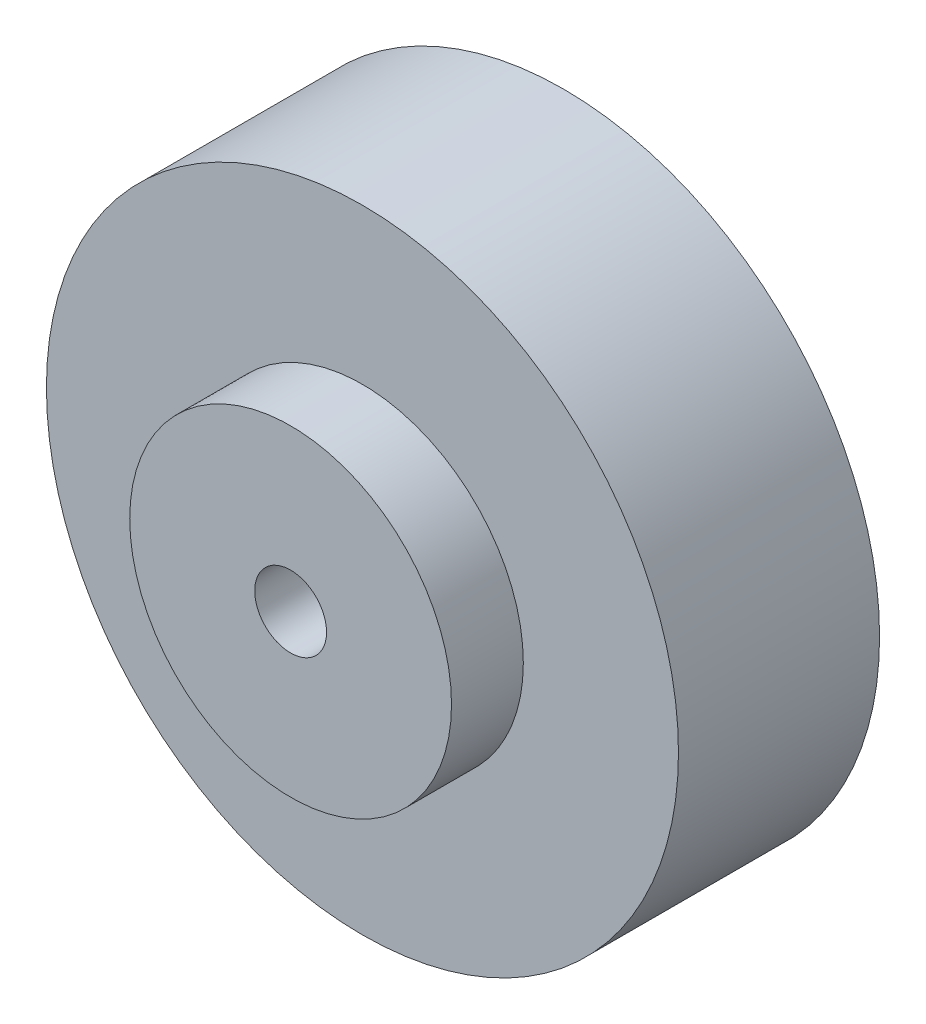
ISO-10303-21;
HEADER;
FILE_DESCRIPTION(('STEP AP214'),'2;1');
FILE_NAME('part.step','',(''),(''),'','','');
FILE_SCHEMA(('AUTOMOTIVE_DESIGN { 1 0 10303 214 1 1 1 1 }'));
ENDSEC;
DATA;
#1=APPLICATION_CONTEXT('core data for automotive mechanical design processes');
#2=APPLICATION_PROTOCOL_DEFINITION('international standard','automotive_design',2000,#1);
#3=PRODUCT_CONTEXT('',#1,'mechanical');
#4=PRODUCT('Part','Part','',(#3));
#5=PRODUCT_RELATED_PRODUCT_CATEGORY('part','',(#4));
#6=PRODUCT_DEFINITION_FORMATION('','',#4);
#7=PRODUCT_DEFINITION_CONTEXT('part definition',#1,'design');
#8=PRODUCT_DEFINITION('design','',#6,#7);
#9=PRODUCT_DEFINITION_SHAPE('','',#8);
#10=(LENGTH_UNIT() NAMED_UNIT(*) SI_UNIT(.MILLI.,.METRE.));
#11=(NAMED_UNIT(*) PLANE_ANGLE_UNIT() SI_UNIT($,.RADIAN.));
#12=(NAMED_UNIT(*) SI_UNIT($,.STERADIAN.) SOLID_ANGLE_UNIT());
#13=UNCERTAINTY_MEASURE_WITH_UNIT(LENGTH_MEASURE(1.E-05),#10,'distance_accuracy_value','');
#14=(GEOMETRIC_REPRESENTATION_CONTEXT(3) GLOBAL_UNCERTAINTY_ASSIGNED_CONTEXT((#13)) GLOBAL_UNIT_ASSIGNED_CONTEXT((#10,
#11,#12)) REPRESENTATION_CONTEXT('',''));
#15=CARTESIAN_POINT('',(0.,0.,0.));
#16=DIRECTION('',(0.,0.,1.));
#17=DIRECTION('',(1.,0.,0.));
#18=AXIS2_PLACEMENT_3D('',#15,#16,#17);
#19=CARTESIAN_POINT('',(0.,0.,22.225));
#20=DIRECTION('',(0.,0.,-1.));
#21=DIRECTION('',(-1.,0.,0.));
#22=AXIS2_PLACEMENT_3D('',#19,#20,#21);
#23=CYLINDRICAL_SURFACE('',#22,34.925);
#24=CARTESIAN_POINT('',(0.,0.,22.225));
#25=DIRECTION('',(0.,0.,1.));
#26=DIRECTION('',(1.,0.,0.));
#27=AXIS2_PLACEMENT_3D('',#24,#25,#26);
#28=CIRCLE('',#27,34.925);
#29=CARTESIAN_POINT('',(34.925,0.,22.225));
#30=VERTEX_POINT('',#29);
#31=EDGE_CURVE('E53',#30,#30,#28,.T.);
#32=ORIENTED_EDGE('',*,*,#31,.F.);
#33=EDGE_LOOP('',(#32));
#34=FACE_BOUND('',#33,.T.);
#35=CARTESIAN_POINT('',(0.,0.,0.));
#36=DIRECTION('',(0.,0.,1.));
#37=DIRECTION('',(1.,0.,0.));
#38=AXIS2_PLACEMENT_3D('',#35,#36,#37);
#39=CIRCLE('',#38,34.925);
#40=CARTESIAN_POINT('',(34.925,0.,0.));
#41=VERTEX_POINT('',#40);
#42=EDGE_CURVE('E48',#41,#41,#39,.T.);
#43=ORIENTED_EDGE('',*,*,#42,.T.);
#44=EDGE_LOOP('',(#43));
#45=FACE_BOUND('',#44,.T.);
#46=ADVANCED_FACE('F45',(#34,#45),#23,.T.);
#47=CARTESIAN_POINT('',(0.,0.,22.225));
#48=DIRECTION('',(0.,0.,1.));
#49=DIRECTION('',(1.,0.,0.));
#50=AXIS2_PLACEMENT_3D('',#47,#48,#49);
#51=PLANE('',#50);
#52=CARTESIAN_POINT('',(0.,0.,22.225));
#53=DIRECTION('',(0.,0.,1.));
#54=DIRECTION('',(1.,0.,0.));
#55=AXIS2_PLACEMENT_3D('',#52,#53,#54);
#56=CIRCLE('',#55,17.78);
#57=CARTESIAN_POINT('',(17.78,0.,22.225));
#58=VERTEX_POINT('',#57);
#59=EDGE_CURVE('E10',#58,#58,#56,.T.);
#60=ORIENTED_EDGE('',*,*,#59,.F.);
#61=EDGE_LOOP('',(#60));
#62=FACE_BOUND('',#61,.T.);
#63=ORIENTED_EDGE('',*,*,#31,.T.);
#64=EDGE_LOOP('',(#63));
#65=FACE_BOUND('',#64,.T.);
#66=ADVANCED_FACE('F89',(#62,#65),#51,.T.);
#67=CARTESIAN_POINT('',(0.,0.,0.));
#68=DIRECTION('',(0.,0.,1.));
#69=DIRECTION('',(1.,0.,0.));
#70=AXIS2_PLACEMENT_3D('',#67,#68,#69);
#71=PLANE('',#70);
#72=CARTESIAN_POINT('',(0.,0.,0.));
#73=DIRECTION('',(0.,0.,1.));
#74=DIRECTION('',(1.,0.,0.));
#75=AXIS2_PLACEMENT_3D('',#72,#73,#74);
#76=CIRCLE('',#75,3.96875);
#77=CARTESIAN_POINT('',(3.96875,0.,0.));
#78=VERTEX_POINT('',#77);
#79=EDGE_CURVE('E64',#78,#78,#76,.F.);
#80=ORIENTED_EDGE('',*,*,#79,.F.);
#81=EDGE_LOOP('',(#80));
#82=FACE_BOUND('',#81,.T.);
#83=ORIENTED_EDGE('',*,*,#42,.F.);
#84=EDGE_LOOP('',(#83));
#85=FACE_BOUND('',#84,.T.);
#86=ADVANCED_FACE('F84',(#82,#85),#71,.F.);
#87=CARTESIAN_POINT('',(0.,0.,30.1625));
#88=DIRECTION('',(0.,0.,-1.));
#89=DIRECTION('',(-1.,0.,0.));
#90=AXIS2_PLACEMENT_3D('',#87,#88,#89);
#91=CYLINDRICAL_SURFACE('',#90,17.78);
#92=CARTESIAN_POINT('',(0.,0.,30.1625));
#93=DIRECTION('',(0.,0.,1.));
#94=DIRECTION('',(1.,0.,0.));
#95=AXIS2_PLACEMENT_3D('',#92,#93,#94);
#96=CIRCLE('',#95,17.78);
#97=CARTESIAN_POINT('',(17.78,0.,30.1625));
#98=VERTEX_POINT('',#97);
#99=EDGE_CURVE('E61',#98,#98,#96,.T.);
#100=ORIENTED_EDGE('',*,*,#99,.F.);
#101=EDGE_LOOP('',(#100));
#102=FACE_BOUND('',#101,.T.);
#103=ORIENTED_EDGE('',*,*,#59,.T.);
#104=EDGE_LOOP('',(#103));
#105=FACE_BOUND('',#104,.T.);
#106=ADVANCED_FACE('F79',(#102,#105),#91,.T.);
#107=CARTESIAN_POINT('',(0.,0.,30.1625));
#108=DIRECTION('',(0.,0.,1.));
#109=DIRECTION('',(1.,0.,0.));
#110=AXIS2_PLACEMENT_3D('',#107,#108,#109);
#111=PLANE('',#110);
#112=CARTESIAN_POINT('',(0.,0.,30.1625));
#113=DIRECTION('',(0.,0.,1.));
#114=DIRECTION('',(1.,0.,0.));
#115=AXIS2_PLACEMENT_3D('',#112,#113,#114);
#116=CIRCLE('',#115,3.96875);
#117=CARTESIAN_POINT('',(3.96875,0.,30.1625));
#118=VERTEX_POINT('',#117);
#119=EDGE_CURVE('E68',#118,#118,#116,.T.);
#120=ORIENTED_EDGE('',*,*,#119,.F.);
#121=EDGE_LOOP('',(#120));
#122=FACE_BOUND('',#121,.T.);
#123=ORIENTED_EDGE('',*,*,#99,.T.);
#124=EDGE_LOOP('',(#123));
#125=FACE_BOUND('',#124,.T.);
#126=ADVANCED_FACE('F76',(#122,#125),#111,.T.);
#127=CARTESIAN_POINT('',(0.,0.,-11.2253201513364));
#128=DIRECTION('',(0.,0.,1.));
#129=DIRECTION('',(1.,0.,0.));
#130=AXIS2_PLACEMENT_3D('',#127,#128,#129);
#131=CYLINDRICAL_SURFACE('',#130,3.96875);
#132=ORIENTED_EDGE('',*,*,#79,.T.);
#133=EDGE_LOOP('',(#132));
#134=FACE_BOUND('',#133,.T.);
#135=ORIENTED_EDGE('',*,*,#119,.T.);
#136=EDGE_LOOP('',(#135));
#137=FACE_BOUND('',#136,.T.);
#138=ADVANCED_FACE('F74',(#134,#137),#131,.F.);
#139=CLOSED_SHELL('',(#46,#66,#86,#106,#126,#138));
#140=MANIFOLD_SOLID_BREP('B2',#139);
#141=ADVANCED_BREP_SHAPE_REPRESENTATION('',(#18,#140),#14);
#142=SHAPE_DEFINITION_REPRESENTATION(#9,#141);
ENDSEC;
END-ISO-10303-21;
